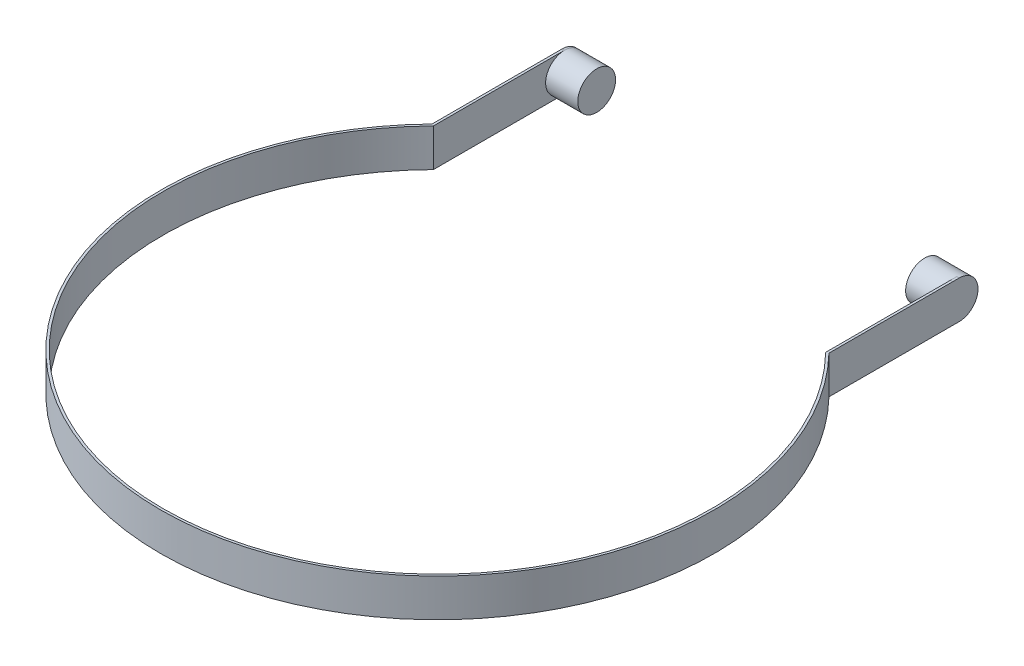
ISO-10303-21;
HEADER;
FILE_DESCRIPTION(('STEP AP214'),'2;1');
FILE_NAME('part.step','',(''),(''),'','','');
FILE_SCHEMA(('AUTOMOTIVE_DESIGN { 1 0 10303 214 1 1 1 1 }'));
ENDSEC;
DATA;
#1=APPLICATION_CONTEXT('core data for automotive mechanical design processes');
#2=APPLICATION_PROTOCOL_DEFINITION('international standard','automotive_design',2000,#1);
#3=PRODUCT_CONTEXT('',#1,'mechanical');
#4=PRODUCT('Part','Part','',(#3));
#5=PRODUCT_RELATED_PRODUCT_CATEGORY('part','',(#4));
#6=PRODUCT_DEFINITION_FORMATION('','',#4);
#7=PRODUCT_DEFINITION_CONTEXT('part definition',#1,'design');
#8=PRODUCT_DEFINITION('design','',#6,#7);
#9=PRODUCT_DEFINITION_SHAPE('','',#8);
#10=(LENGTH_UNIT() NAMED_UNIT(*) SI_UNIT(.MILLI.,.METRE.));
#11=(NAMED_UNIT(*) PLANE_ANGLE_UNIT() SI_UNIT($,.RADIAN.));
#12=(NAMED_UNIT(*) SI_UNIT($,.STERADIAN.) SOLID_ANGLE_UNIT());
#13=UNCERTAINTY_MEASURE_WITH_UNIT(LENGTH_MEASURE(1.E-05),#10,'distance_accuracy_value','');
#14=(GEOMETRIC_REPRESENTATION_CONTEXT(3) GLOBAL_UNCERTAINTY_ASSIGNED_CONTEXT((#13)) GLOBAL_UNIT_ASSIGNED_CONTEXT((#10,
#11,#12)) REPRESENTATION_CONTEXT('',''));
#15=CARTESIAN_POINT('',(0.,0.,0.));
#16=DIRECTION('',(0.,0.,1.));
#17=DIRECTION('',(1.,0.,0.));
#18=AXIS2_PLACEMENT_3D('',#15,#16,#17);
#19=CARTESIAN_POINT('',(-253.005,24.125,0.));
#20=DIRECTION('',(1.,0.,0.));
#21=DIRECTION('',(0.,0.,-1.));
#22=AXIS2_PLACEMENT_3D('',#19,#20,#21);
#23=PLANE('',#22);
#24=CARTESIAN_POINT('',(-253.005,0.,0.));
#25=DIRECTION('',(-1.,0.,0.));
#26=DIRECTION('',(0.,0.,1.));
#27=AXIS2_PLACEMENT_3D('',#24,#25,#26);
#28=CIRCLE('',#27,24.125);
#29=CARTESIAN_POINT('',(-253.005,24.125,0.));
#30=VERTEX_POINT('',#29);
#31=CARTESIAN_POINT('',(-253.005,-24.125,0.));
#32=VERTEX_POINT('',#31);
#33=EDGE_CURVE('E106',#30,#32,#28,.T.);
#34=ORIENTED_EDGE('',*,*,#33,.T.);
#35=DIRECTION('',(0.,0.,1.));
#36=VECTOR('',#35,1.);
#37=CARTESIAN_POINT('',(-253.005,-24.125,0.));
#38=LINE('',#37,#36);
#39=CARTESIAN_POINT('',(-253.005,-24.125,165.889796395397));
#40=VERTEX_POINT('',#39);
#41=EDGE_CURVE('E109',#32,#40,#38,.T.);
#42=ORIENTED_EDGE('',*,*,#41,.T.);
#43=DIRECTION('',(0.,-1.,0.));
#44=VECTOR('',#43,1.);
#45=CARTESIAN_POINT('',(-253.005,24.125,165.889796395397));
#46=LINE('',#45,#44);
#47=CARTESIAN_POINT('',(-253.005,24.125,165.889796395397));
#48=VERTEX_POINT('',#47);
#49=EDGE_CURVE('E148',#48,#40,#46,.T.);
#50=ORIENTED_EDGE('',*,*,#49,.F.);
#51=DIRECTION('',(0.,0.,1.));
#52=VECTOR('',#51,1.);
#53=CARTESIAN_POINT('',(-253.005,24.125,0.));
#54=LINE('',#53,#52);
#55=EDGE_CURVE('E111',#30,#48,#54,.T.);
#56=ORIENTED_EDGE('',*,*,#55,.F.);
#57=EDGE_LOOP('',(#34,#42,#50,#56));
#58=FACE_BOUND('',#57,.T.);
#59=ADVANCED_FACE('F42',(#58),#23,.F.);
#60=CARTESIAN_POINT('',(253.005,24.125,0.));
#61=DIRECTION('',(1.,0.,0.));
#62=DIRECTION('',(0.,0.,-1.));
#63=AXIS2_PLACEMENT_3D('',#60,#61,#62);
#64=PLANE('',#63);
#65=CARTESIAN_POINT('',(253.005,0.,0.));
#66=DIRECTION('',(1.,0.,0.));
#67=DIRECTION('',(0.,0.,-1.));
#68=AXIS2_PLACEMENT_3D('',#65,#66,#67);
#69=CIRCLE('',#68,24.125);
#70=CARTESIAN_POINT('',(253.005,-24.125,0.));
#71=VERTEX_POINT('',#70);
#72=CARTESIAN_POINT('',(253.005,24.125,0.));
#73=VERTEX_POINT('',#72);
#74=EDGE_CURVE('E56',#71,#73,#69,.T.);
#75=ORIENTED_EDGE('',*,*,#74,.T.);
#76=DIRECTION('',(0.,0.,1.));
#77=VECTOR('',#76,1.);
#78=CARTESIAN_POINT('',(253.005,24.125,0.));
#79=LINE('',#78,#77);
#80=CARTESIAN_POINT('',(253.005,24.125,165.889796395396));
#81=VERTEX_POINT('',#80);
#82=EDGE_CURVE('E272',#73,#81,#79,.T.);
#83=ORIENTED_EDGE('',*,*,#82,.T.);
#84=DIRECTION('',(0.,-1.,0.));
#85=VECTOR('',#84,1.);
#86=CARTESIAN_POINT('',(253.005,24.125,165.889796395396));
#87=LINE('',#86,#85);
#88=CARTESIAN_POINT('',(253.005,-24.125,165.889796395396));
#89=VERTEX_POINT('',#88);
#90=EDGE_CURVE('E145',#81,#89,#87,.T.);
#91=ORIENTED_EDGE('',*,*,#90,.T.);
#92=DIRECTION('',(0.,0.,1.));
#93=VECTOR('',#92,1.);
#94=CARTESIAN_POINT('',(253.005,-24.125,0.));
#95=LINE('',#94,#93);
#96=EDGE_CURVE('E124',#71,#89,#95,.T.);
#97=ORIENTED_EDGE('',*,*,#96,.F.);
#98=EDGE_LOOP('',(#75,#83,#91,#97));
#99=FACE_BOUND('',#98,.T.);
#100=ADVANCED_FACE('F168',(#99),#64,.T.);
#101=CARTESIAN_POINT('',(-250.,24.125,0.));
#102=DIRECTION('',(1.,0.,0.));
#103=DIRECTION('',(0.,0.,-1.));
#104=AXIS2_PLACEMENT_3D('',#101,#102,#103);
#105=PLANE('',#104);
#106=DIRECTION('',(0.,0.,1.));
#107=VECTOR('',#106,1.);
#108=CARTESIAN_POINT('',(-250.,-24.125,0.));
#109=LINE('',#108,#107);
#110=CARTESIAN_POINT('',(-250.,-24.125,0.));
#111=VERTEX_POINT('',#110);
#112=CARTESIAN_POINT('',(-250.,-24.125,167.113525721682));
#113=VERTEX_POINT('',#112);
#114=EDGE_CURVE('E137',#111,#113,#109,.T.);
#115=ORIENTED_EDGE('',*,*,#114,.F.);
#116=CARTESIAN_POINT('',(-250.,0.,0.));
#117=DIRECTION('',(1.,0.,0.));
#118=DIRECTION('',(0.,0.,-1.));
#119=AXIS2_PLACEMENT_3D('',#116,#117,#118);
#120=CIRCLE('',#119,24.125);
#121=CARTESIAN_POINT('',(-250.,24.125,0.));
#122=VERTEX_POINT('',#121);
#123=EDGE_CURVE('E64',#111,#122,#120,.T.);
#124=ORIENTED_EDGE('',*,*,#123,.T.);
#125=DIRECTION('',(0.,0.,1.));
#126=VECTOR('',#125,1.);
#127=CARTESIAN_POINT('',(-250.,24.125,0.));
#128=LINE('',#127,#126);
#129=CARTESIAN_POINT('',(-250.,24.125,167.113525721682));
#130=VERTEX_POINT('',#129);
#131=EDGE_CURVE('E128',#122,#130,#128,.T.);
#132=ORIENTED_EDGE('',*,*,#131,.T.);
#133=DIRECTION('',(0.,-1.,0.));
#134=VECTOR('',#133,1.);
#135=CARTESIAN_POINT('',(-250.,24.125,167.113525721682));
#136=LINE('',#135,#134);
#137=EDGE_CURVE('E139',#130,#113,#136,.T.);
#138=ORIENTED_EDGE('',*,*,#137,.T.);
#139=EDGE_LOOP('',(#115,#124,#132,#138));
#140=FACE_BOUND('',#139,.T.);
#141=ADVANCED_FACE('F172',(#140),#105,.T.);
#142=CARTESIAN_POINT('',(0.,24.125,0.));
#143=DIRECTION('',(0.,1.,0.));
#144=DIRECTION('',(0.,0.,1.));
#145=AXIS2_PLACEMENT_3D('',#142,#143,#144);
#146=PLANE('',#145);
#147=ORIENTED_EDGE('',*,*,#82,.F.);
#148=DIRECTION('',(-1.,0.,0.));
#149=VECTOR('',#148,1.);
#150=CARTESIAN_POINT('',(353.005,24.125,0.));
#151=LINE('',#150,#149);
#152=CARTESIAN_POINT('',(250.,24.125,0.));
#153=VERTEX_POINT('',#152);
#154=EDGE_CURVE('E273',#73,#153,#151,.T.);
#155=ORIENTED_EDGE('',*,*,#154,.T.);
#156=DIRECTION('',(0.,0.,1.));
#157=VECTOR('',#156,1.);
#158=CARTESIAN_POINT('',(250.,24.125,0.));
#159=LINE('',#158,#157);
#160=CARTESIAN_POINT('',(250.,24.125,167.113525721682));
#161=VERTEX_POINT('',#160);
#162=EDGE_CURVE('E278',#153,#161,#159,.T.);
#163=ORIENTED_EDGE('',*,*,#162,.T.);
#164=CARTESIAN_POINT('',(0.,24.125,412.0625));
#165=DIRECTION('',(0.,1.,0.));
#166=DIRECTION('',(0.,0.,1.));
#167=AXIS2_PLACEMENT_3D('',#164,#165,#166);
#168=CIRCLE('',#167,350.);
#169=EDGE_CURVE('E280',#130,#161,#168,.T.);
#170=ORIENTED_EDGE('',*,*,#169,.F.);
#171=ORIENTED_EDGE('',*,*,#131,.F.);
#172=EDGE_CURVE('E113',#122,#30,#151,.T.);
#173=ORIENTED_EDGE('',*,*,#172,.T.);
#174=ORIENTED_EDGE('',*,*,#55,.T.);
#175=CARTESIAN_POINT('',(0.,24.125,412.0625));
#176=DIRECTION('',(0.,1.,0.));
#177=DIRECTION('',(0.,0.,1.));
#178=AXIS2_PLACEMENT_3D('',#175,#176,#177);
#179=CIRCLE('',#178,353.005);
#180=EDGE_CURVE('E276',#48,#81,#179,.T.);
#181=ORIENTED_EDGE('',*,*,#180,.T.);
#182=EDGE_LOOP('',(#147,#155,#163,#170,#171,#173,#174,#181));
#183=FACE_BOUND('',#182,.T.);
#184=ADVANCED_FACE('F185',(#183),#146,.T.);
#185=CARTESIAN_POINT('',(0.,-24.125,0.));
#186=DIRECTION('',(0.,1.,0.));
#187=DIRECTION('',(0.,0.,1.));
#188=AXIS2_PLACEMENT_3D('',#185,#186,#187);
#189=PLANE('',#188);
#190=DIRECTION('',(-1.,0.,0.));
#191=VECTOR('',#190,1.);
#192=CARTESIAN_POINT('',(353.005,-24.125,0.));
#193=LINE('',#192,#191);
#194=CARTESIAN_POINT('',(250.,-24.125,0.));
#195=VERTEX_POINT('',#194);
#196=EDGE_CURVE('E12',#71,#195,#193,.T.);
#197=ORIENTED_EDGE('',*,*,#196,.F.);
#198=ORIENTED_EDGE('',*,*,#96,.T.);
#199=CARTESIAN_POINT('',(0.,-24.125,412.0625));
#200=DIRECTION('',(0.,1.,0.));
#201=DIRECTION('',(0.,0.,1.));
#202=AXIS2_PLACEMENT_3D('',#199,#200,#201);
#203=CIRCLE('',#202,353.005);
#204=EDGE_CURVE('E121',#40,#89,#203,.T.);
#205=ORIENTED_EDGE('',*,*,#204,.F.);
#206=ORIENTED_EDGE('',*,*,#41,.F.);
#207=EDGE_CURVE('E46',#111,#32,#193,.T.);
#208=ORIENTED_EDGE('',*,*,#207,.F.);
#209=ORIENTED_EDGE('',*,*,#114,.T.);
#210=CARTESIAN_POINT('',(0.,-24.125,412.0625));
#211=DIRECTION('',(0.,1.,0.));
#212=DIRECTION('',(0.,0.,1.));
#213=AXIS2_PLACEMENT_3D('',#210,#211,#212);
#214=CIRCLE('',#213,350.);
#215=CARTESIAN_POINT('',(250.,-24.125,167.113525721682));
#216=VERTEX_POINT('',#215);
#217=EDGE_CURVE('E134',#113,#216,#214,.T.);
#218=ORIENTED_EDGE('',*,*,#217,.T.);
#219=DIRECTION('',(0.,0.,1.));
#220=VECTOR('',#219,1.);
#221=CARTESIAN_POINT('',(250.,-24.125,0.));
#222=LINE('',#221,#220);
#223=EDGE_CURVE('E132',#195,#216,#222,.T.);
#224=ORIENTED_EDGE('',*,*,#223,.F.);
#225=EDGE_LOOP('',(#197,#198,#205,#206,#208,#209,#218,#224));
#226=FACE_BOUND('',#225,.T.);
#227=ADVANCED_FACE('F119',(#226),#189,.F.);
#228=CARTESIAN_POINT('',(-209.,0.,0.));
#229=DIRECTION('',(1.,0.,0.));
#230=DIRECTION('',(0.,0.,-1.));
#231=AXIS2_PLACEMENT_3D('',#228,#229,#230);
#232=CYLINDRICAL_SURFACE('',#231,24.125);
#233=ORIENTED_EDGE('',*,*,#196,.T.);
#234=CARTESIAN_POINT('',(250.,0.,0.));
#235=DIRECTION('',(1.,0.,0.));
#236=DIRECTION('',(0.,0.,-1.));
#237=AXIS2_PLACEMENT_3D('',#234,#235,#236);
#238=CIRCLE('',#237,24.125);
#239=EDGE_CURVE('E150',#153,#195,#238,.T.);
#240=ORIENTED_EDGE('',*,*,#239,.F.);
#241=ORIENTED_EDGE('',*,*,#154,.F.);
#242=ORIENTED_EDGE('',*,*,#74,.F.);
#243=EDGE_LOOP('',(#233,#240,#241,#242));
#244=FACE_BOUND('',#243,.T.);
#245=CARTESIAN_POINT('',(209.,0.,0.));
#246=DIRECTION('',(1.,0.,0.));
#247=DIRECTION('',(0.,0.,-1.));
#248=AXIS2_PLACEMENT_3D('',#245,#246,#247);
#249=CIRCLE('',#248,24.125);
#250=CARTESIAN_POINT('',(209.,0.,-24.125));
#251=VERTEX_POINT('',#250);
#252=EDGE_CURVE('E118',#251,#251,#249,.T.);
#253=ORIENTED_EDGE('',*,*,#252,.T.);
#254=EDGE_LOOP('',(#253));
#255=FACE_BOUND('',#254,.T.);
#256=ADVANCED_FACE('F44',(#244,#255),#232,.T.);
#257=CARTESIAN_POINT('',(209.,0.,-24.125));
#258=DIRECTION('',(-1.,0.,0.));
#259=DIRECTION('',(0.,0.,1.));
#260=AXIS2_PLACEMENT_3D('',#257,#258,#259);
#261=PLANE('',#260);
#262=ORIENTED_EDGE('',*,*,#252,.F.);
#263=EDGE_LOOP('',(#262));
#264=FACE_BOUND('',#263,.T.);
#265=ADVANCED_FACE('F156',(#264),#261,.T.);
#266=CARTESIAN_POINT('',(250.,24.125,0.));
#267=DIRECTION('',(1.,0.,0.));
#268=DIRECTION('',(0.,0.,-1.));
#269=AXIS2_PLACEMENT_3D('',#266,#267,#268);
#270=PLANE('',#269);
#271=ORIENTED_EDGE('',*,*,#239,.T.);
#272=ORIENTED_EDGE('',*,*,#223,.T.);
#273=DIRECTION('',(0.,-1.,0.));
#274=VECTOR('',#273,1.);
#275=CARTESIAN_POINT('',(250.,24.125,167.113525721682));
#276=LINE('',#275,#274);
#277=EDGE_CURVE('E142',#161,#216,#276,.T.);
#278=ORIENTED_EDGE('',*,*,#277,.F.);
#279=ORIENTED_EDGE('',*,*,#162,.F.);
#280=EDGE_LOOP('',(#271,#272,#278,#279));
#281=FACE_BOUND('',#280,.T.);
#282=ADVANCED_FACE('F158',(#281),#270,.F.);
#283=CARTESIAN_POINT('',(0.,24.125,412.0625));
#284=DIRECTION('',(0.,-1.,0.));
#285=DIRECTION('',(0.,0.,-1.));
#286=AXIS2_PLACEMENT_3D('',#283,#284,#285);
#287=CYLINDRICAL_SURFACE('',#286,353.005);
#288=ORIENTED_EDGE('',*,*,#204,.T.);
#289=ORIENTED_EDGE('',*,*,#90,.F.);
#290=ORIENTED_EDGE('',*,*,#180,.F.);
#291=ORIENTED_EDGE('',*,*,#49,.T.);
#292=EDGE_LOOP('',(#288,#289,#290,#291));
#293=FACE_BOUND('',#292,.T.);
#294=ADVANCED_FACE('F163',(#293),#287,.T.);
#295=CARTESIAN_POINT('',(0.,24.125,412.0625));
#296=DIRECTION('',(0.,-1.,0.));
#297=DIRECTION('',(0.,0.,-1.));
#298=AXIS2_PLACEMENT_3D('',#295,#296,#297);
#299=CYLINDRICAL_SURFACE('',#298,350.);
#300=ORIENTED_EDGE('',*,*,#217,.F.);
#301=ORIENTED_EDGE('',*,*,#137,.F.);
#302=ORIENTED_EDGE('',*,*,#169,.T.);
#303=ORIENTED_EDGE('',*,*,#277,.T.);
#304=EDGE_LOOP('',(#300,#301,#302,#303));
#305=FACE_BOUND('',#304,.T.);
#306=ADVANCED_FACE('F177',(#305),#299,.F.);
#307=CARTESIAN_POINT('',(353.005,0.,0.));
#308=DIRECTION('',(-1.,0.,0.));
#309=DIRECTION('',(0.,0.,1.));
#310=AXIS2_PLACEMENT_3D('',#307,#308,#309);
#311=CYLINDRICAL_SURFACE('',#310,24.125);
#312=ORIENTED_EDGE('',*,*,#123,.F.);
#313=ORIENTED_EDGE('',*,*,#207,.T.);
#314=ORIENTED_EDGE('',*,*,#33,.F.);
#315=ORIENTED_EDGE('',*,*,#172,.F.);
#316=EDGE_LOOP('',(#312,#313,#314,#315));
#317=FACE_BOUND('',#316,.T.);
#318=ADVANCED_FACE('F115',(#317),#311,.T.);
#319=CLOSED_SHELL('',(#59,#100,#141,#184,#227,#256,#265,#282,#294,#306,#318));
#320=MANIFOLD_SOLID_BREP('B2',#319);
#321=CARTESIAN_POINT('',(-250.,0.,0.));
#322=DIRECTION('',(-1.,0.,0.));
#323=DIRECTION('',(0.,0.,1.));
#324=AXIS2_PLACEMENT_3D('',#321,#322,#323);
#325=PLANE('',#324);
#326=CARTESIAN_POINT('',(-250.,0.,0.));
#327=DIRECTION('',(1.,0.,0.));
#328=DIRECTION('',(0.,0.,-1.));
#329=AXIS2_PLACEMENT_3D('',#326,#327,#328);
#330=CIRCLE('',#329,24.125);
#331=CARTESIAN_POINT('',(-250.,0.,-24.125));
#332=VERTEX_POINT('',#331);
#333=EDGE_CURVE('E41',#332,#332,#330,.T.);
#334=ORIENTED_EDGE('',*,*,#333,.F.);
#335=EDGE_LOOP('',(#334));
#336=FACE_BOUND('',#335,.T.);
#337=ADVANCED_FACE('F297',(#336),#325,.T.);
#338=CARTESIAN_POINT('',(-209.,0.,0.));
#339=DIRECTION('',(1.,0.,0.));
#340=DIRECTION('',(0.,0.,-1.));
#341=AXIS2_PLACEMENT_3D('',#338,#339,#340);
#342=CYLINDRICAL_SURFACE('',#341,24.125);
#343=CARTESIAN_POINT('',(-209.,0.,0.));
#344=DIRECTION('',(1.,0.,0.));
#345=DIRECTION('',(0.,0.,-1.));
#346=AXIS2_PLACEMENT_3D('',#343,#344,#345);
#347=CIRCLE('',#346,24.125);
#348=CARTESIAN_POINT('',(-209.,0.,-24.125));
#349=VERTEX_POINT('',#348);
#350=EDGE_CURVE('E303',#349,#349,#347,.T.);
#351=ORIENTED_EDGE('',*,*,#350,.F.);
#352=EDGE_LOOP('',(#351));
#353=FACE_BOUND('',#352,.T.);
#354=ORIENTED_EDGE('',*,*,#333,.T.);
#355=EDGE_LOOP('',(#354));
#356=FACE_BOUND('',#355,.T.);
#357=ADVANCED_FACE('F311',(#353,#356),#342,.T.);
#358=CARTESIAN_POINT('',(-209.,0.,-24.125));
#359=DIRECTION('',(1.,0.,0.));
#360=DIRECTION('',(0.,0.,-1.));
#361=AXIS2_PLACEMENT_3D('',#358,#359,#360);
#362=PLANE('',#361);
#363=ORIENTED_EDGE('',*,*,#350,.T.);
#364=EDGE_LOOP('',(#363));
#365=FACE_BOUND('',#364,.T.);
#366=ADVANCED_FACE('F309',(#365),#362,.T.);
#367=CLOSED_SHELL('',(#337,#357,#366));
#368=MANIFOLD_SOLID_BREP('B6',#367);
#369=ADVANCED_BREP_SHAPE_REPRESENTATION('',(#18,#320,#368),#14);
#370=SHAPE_DEFINITION_REPRESENTATION(#9,#369);
ENDSEC;
END-ISO-10303-21;
